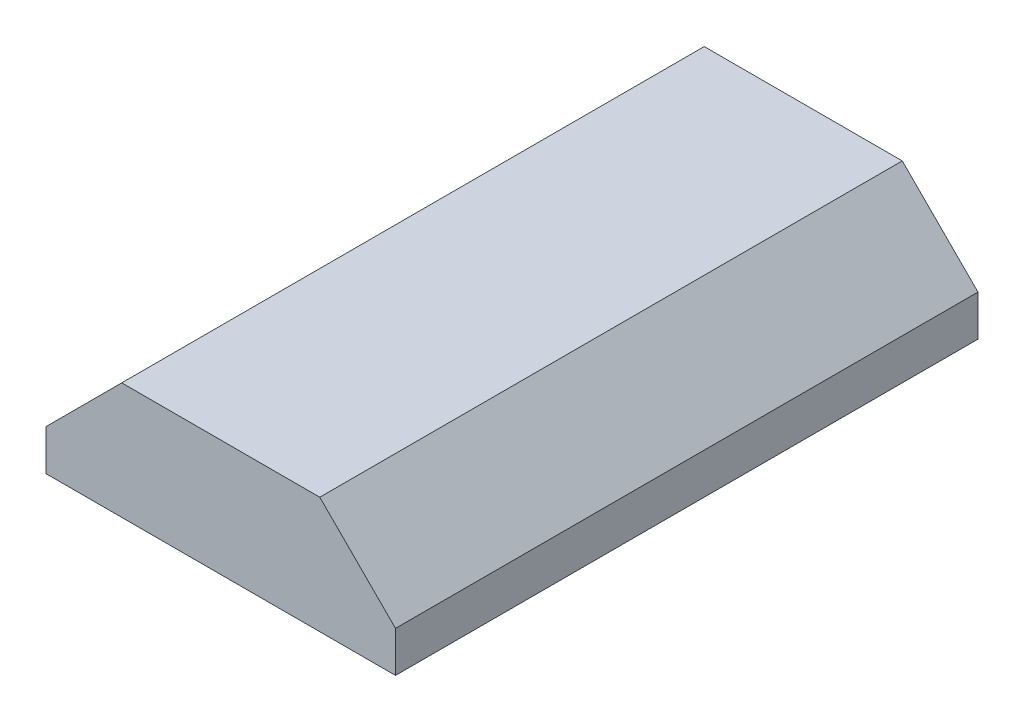
ISO-10303-21;
HEADER;
FILE_DESCRIPTION(('STEP AP214'),'2;1');
FILE_NAME('part.step','',(''),(''),'','','');
FILE_SCHEMA(('AUTOMOTIVE_DESIGN { 1 0 10303 214 1 1 1 1 }'));
ENDSEC;
DATA;
#1=APPLICATION_CONTEXT('core data for automotive mechanical design processes');
#2=APPLICATION_PROTOCOL_DEFINITION('international standard','automotive_design',2000,#1);
#3=PRODUCT_CONTEXT('',#1,'mechanical');
#4=PRODUCT('Part','Part','',(#3));
#5=PRODUCT_RELATED_PRODUCT_CATEGORY('part','',(#4));
#6=PRODUCT_DEFINITION_FORMATION('','',#4);
#7=PRODUCT_DEFINITION_CONTEXT('part definition',#1,'design');
#8=PRODUCT_DEFINITION('design','',#6,#7);
#9=PRODUCT_DEFINITION_SHAPE('','',#8);
#10=(LENGTH_UNIT() NAMED_UNIT(*) SI_UNIT(.MILLI.,.METRE.));
#11=(NAMED_UNIT(*) PLANE_ANGLE_UNIT() SI_UNIT($,.RADIAN.));
#12=(NAMED_UNIT(*) SI_UNIT($,.STERADIAN.) SOLID_ANGLE_UNIT());
#13=UNCERTAINTY_MEASURE_WITH_UNIT(LENGTH_MEASURE(1.E-05),#10,'distance_accuracy_value','');
#14=(GEOMETRIC_REPRESENTATION_CONTEXT(3) GLOBAL_UNCERTAINTY_ASSIGNED_CONTEXT((#13)) GLOBAL_UNIT_ASSIGNED_CONTEXT((#10,
#11,#12)) REPRESENTATION_CONTEXT('',''));
#15=CARTESIAN_POINT('',(0.,0.,0.));
#16=DIRECTION('',(0.,0.,1.));
#17=DIRECTION('',(1.,0.,0.));
#18=AXIS2_PLACEMENT_3D('',#15,#16,#17);
#19=CARTESIAN_POINT('',(3.4,1.80885878693797,20.));
#20=DIRECTION('',(0.707106781186549,0.707106781186546,0.));
#21=DIRECTION('',(-0.707106781186546,0.707106781186549,0.));
#22=AXIS2_PLACEMENT_3D('',#19,#20,#21);
#23=PLANE('',#22);
#24=DIRECTION('',(0.707106781186546,-0.707106781186549,0.));
#25=VECTOR('',#24,1.);
#26=CARTESIAN_POINT('',(3.4,1.80885878693797,0.));
#27=LINE('',#26,#25);
#28=CARTESIAN_POINT('',(3.4,1.80885878693797,0.));
#29=VERTEX_POINT('',#28);
#30=CARTESIAN_POINT('',(6.,-0.791141213062042,0.));
#31=VERTEX_POINT('',#30);
#32=EDGE_CURVE('E127',#29,#31,#27,.T.);
#33=ORIENTED_EDGE('',*,*,#32,.F.);
#34=DIRECTION('',(0.,0.,-1.));
#35=VECTOR('',#34,1.);
#36=CARTESIAN_POINT('',(3.4,1.80885878693797,20.));
#37=LINE('',#36,#35);
#38=CARTESIAN_POINT('',(3.4,1.80885878693797,20.));
#39=VERTEX_POINT('',#38);
#40=EDGE_CURVE('E11',#39,#29,#37,.T.);
#41=ORIENTED_EDGE('',*,*,#40,.F.);
#42=DIRECTION('',(0.707106781186546,-0.707106781186549,0.));
#43=VECTOR('',#42,1.);
#44=CARTESIAN_POINT('',(3.4,1.80885878693797,20.));
#45=LINE('',#44,#43);
#46=CARTESIAN_POINT('',(6.,-0.791141213062042,20.));
#47=VERTEX_POINT('',#46);
#48=EDGE_CURVE('E139',#39,#47,#45,.T.);
#49=ORIENTED_EDGE('',*,*,#48,.T.);
#50=DIRECTION('',(0.,0.,-1.));
#51=VECTOR('',#50,1.);
#52=CARTESIAN_POINT('',(6.,-0.791141213062042,20.));
#53=LINE('',#52,#51);
#54=EDGE_CURVE('E44',#47,#31,#53,.T.);
#55=ORIENTED_EDGE('',*,*,#54,.T.);
#56=EDGE_LOOP('',(#33,#41,#49,#55));
#57=FACE_BOUND('',#56,.T.);
#58=ADVANCED_FACE('F41',(#57),#23,.T.);
#59=CARTESIAN_POINT('',(3.4,1.80885878693797,20.));
#60=DIRECTION('',(0.,-1.,0.));
#61=DIRECTION('',(0.,0.,-1.));
#62=AXIS2_PLACEMENT_3D('',#59,#60,#61);
#63=PLANE('',#62);
#64=DIRECTION('',(-1.,0.,0.));
#65=VECTOR('',#64,1.);
#66=CARTESIAN_POINT('',(3.4,1.80885878693797,0.));
#67=LINE('',#66,#65);
#68=CARTESIAN_POINT('',(-3.4,1.80885878693797,0.));
#69=VERTEX_POINT('',#68);
#70=EDGE_CURVE('E80',#29,#69,#67,.T.);
#71=ORIENTED_EDGE('',*,*,#70,.T.);
#72=DIRECTION('',(0.,0.,-1.));
#73=VECTOR('',#72,1.);
#74=CARTESIAN_POINT('',(-3.4,1.80885878693797,20.));
#75=LINE('',#74,#73);
#76=CARTESIAN_POINT('',(-3.4,1.80885878693797,20.));
#77=VERTEX_POINT('',#76);
#78=EDGE_CURVE('E50',#77,#69,#75,.T.);
#79=ORIENTED_EDGE('',*,*,#78,.F.);
#80=DIRECTION('',(-1.,0.,0.));
#81=VECTOR('',#80,1.);
#82=CARTESIAN_POINT('',(3.4,1.80885878693797,20.));
#83=LINE('',#82,#81);
#84=EDGE_CURVE('E105',#39,#77,#83,.T.);
#85=ORIENTED_EDGE('',*,*,#84,.F.);
#86=ORIENTED_EDGE('',*,*,#40,.T.);
#87=EDGE_LOOP('',(#71,#79,#85,#86));
#88=FACE_BOUND('',#87,.T.);
#89=ADVANCED_FACE('F159',(#88),#63,.F.);
#90=CARTESIAN_POINT('',(-3.4,1.80885878693797,20.));
#91=DIRECTION('',(0.707106781186549,-0.707106781186546,0.));
#92=DIRECTION('',(0.707106781186546,0.707106781186549,0.));
#93=AXIS2_PLACEMENT_3D('',#90,#91,#92);
#94=PLANE('',#93);
#95=DIRECTION('',(-0.707106781186546,-0.707106781186549,0.));
#96=VECTOR('',#95,1.);
#97=CARTESIAN_POINT('',(-3.4,1.80885878693797,0.));
#98=LINE('',#97,#96);
#99=CARTESIAN_POINT('',(-6.,-0.791141213062042,0.));
#100=VERTEX_POINT('',#99);
#101=EDGE_CURVE('E112',#69,#100,#98,.T.);
#102=ORIENTED_EDGE('',*,*,#101,.T.);
#103=DIRECTION('',(0.,0.,-1.));
#104=VECTOR('',#103,1.);
#105=CARTESIAN_POINT('',(-6.,-0.791141213062042,20.));
#106=LINE('',#105,#104);
#107=CARTESIAN_POINT('',(-6.,-0.791141213062042,20.));
#108=VERTEX_POINT('',#107);
#109=EDGE_CURVE('E109',#108,#100,#106,.T.);
#110=ORIENTED_EDGE('',*,*,#109,.F.);
#111=DIRECTION('',(-0.707106781186546,-0.707106781186549,0.));
#112=VECTOR('',#111,1.);
#113=CARTESIAN_POINT('',(-3.4,1.80885878693797,20.));
#114=LINE('',#113,#112);
#115=EDGE_CURVE('E98',#77,#108,#114,.T.);
#116=ORIENTED_EDGE('',*,*,#115,.F.);
#117=ORIENTED_EDGE('',*,*,#78,.T.);
#118=EDGE_LOOP('',(#102,#110,#116,#117));
#119=FACE_BOUND('',#118,.T.);
#120=ADVANCED_FACE('F110',(#119),#94,.F.);
#121=CARTESIAN_POINT('',(-6.,-0.791141213062042,20.));
#122=DIRECTION('',(1.,0.,0.));
#123=DIRECTION('',(0.,0.,-1.));
#124=AXIS2_PLACEMENT_3D('',#121,#122,#123);
#125=PLANE('',#124);
#126=DIRECTION('',(0.,-1.,0.));
#127=VECTOR('',#126,1.);
#128=CARTESIAN_POINT('',(-6.,-0.791141213062042,0.));
#129=LINE('',#128,#127);
#130=CARTESIAN_POINT('',(-6.,-2.19114121306203,0.));
#131=VERTEX_POINT('',#130);
#132=EDGE_CURVE('E136',#100,#131,#129,.T.);
#133=ORIENTED_EDGE('',*,*,#132,.T.);
#134=DIRECTION('',(0.,0.,-1.));
#135=VECTOR('',#134,1.);
#136=CARTESIAN_POINT('',(-6.,-2.19114121306203,20.));
#137=LINE('',#136,#135);
#138=CARTESIAN_POINT('',(-6.,-2.19114121306203,20.));
#139=VERTEX_POINT('',#138);
#140=EDGE_CURVE('E115',#139,#131,#137,.T.);
#141=ORIENTED_EDGE('',*,*,#140,.F.);
#142=DIRECTION('',(0.,-1.,0.));
#143=VECTOR('',#142,1.);
#144=CARTESIAN_POINT('',(-6.,-0.791141213062042,20.));
#145=LINE('',#144,#143);
#146=EDGE_CURVE('E103',#108,#139,#145,.T.);
#147=ORIENTED_EDGE('',*,*,#146,.F.);
#148=ORIENTED_EDGE('',*,*,#109,.T.);
#149=EDGE_LOOP('',(#133,#141,#147,#148));
#150=FACE_BOUND('',#149,.T.);
#151=ADVANCED_FACE('F117',(#150),#125,.F.);
#152=CARTESIAN_POINT('',(-6.,-2.19114121306203,20.));
#153=DIRECTION('',(0.,1.,0.));
#154=DIRECTION('',(0.,0.,1.));
#155=AXIS2_PLACEMENT_3D('',#152,#153,#154);
#156=PLANE('',#155);
#157=DIRECTION('',(1.,0.,0.));
#158=VECTOR('',#157,1.);
#159=CARTESIAN_POINT('',(-6.,-2.19114121306203,0.));
#160=LINE('',#159,#158);
#161=CARTESIAN_POINT('',(6.,-2.19114121306203,0.));
#162=VERTEX_POINT('',#161);
#163=EDGE_CURVE('E133',#131,#162,#160,.T.);
#164=ORIENTED_EDGE('',*,*,#163,.T.);
#165=DIRECTION('',(0.,0.,-1.));
#166=VECTOR('',#165,1.);
#167=CARTESIAN_POINT('',(6.,-2.19114121306203,20.));
#168=LINE('',#167,#166);
#169=CARTESIAN_POINT('',(6.,-2.19114121306203,20.));
#170=VERTEX_POINT('',#169);
#171=EDGE_CURVE('E142',#170,#162,#168,.T.);
#172=ORIENTED_EDGE('',*,*,#171,.F.);
#173=DIRECTION('',(1.,0.,0.));
#174=VECTOR('',#173,1.);
#175=CARTESIAN_POINT('',(-6.,-2.19114121306203,20.));
#176=LINE('',#175,#174);
#177=EDGE_CURVE('E120',#139,#170,#176,.T.);
#178=ORIENTED_EDGE('',*,*,#177,.F.);
#179=ORIENTED_EDGE('',*,*,#140,.T.);
#180=EDGE_LOOP('',(#164,#172,#178,#179));
#181=FACE_BOUND('',#180,.T.);
#182=ADVANCED_FACE('F149',(#181),#156,.F.);
#183=CARTESIAN_POINT('',(6.,-0.791141213062042,20.));
#184=DIRECTION('',(1.,0.,0.));
#185=DIRECTION('',(0.,0.,-1.));
#186=AXIS2_PLACEMENT_3D('',#183,#184,#185);
#187=PLANE('',#186);
#188=DIRECTION('',(0.,-1.,0.));
#189=VECTOR('',#188,1.);
#190=CARTESIAN_POINT('',(6.,-0.791141213062042,0.));
#191=LINE('',#190,#189);
#192=EDGE_CURVE('E130',#31,#162,#191,.T.);
#193=ORIENTED_EDGE('',*,*,#192,.F.);
#194=ORIENTED_EDGE('',*,*,#54,.F.);
#195=DIRECTION('',(0.,-1.,0.));
#196=VECTOR('',#195,1.);
#197=CARTESIAN_POINT('',(6.,-0.791141213062042,20.));
#198=LINE('',#197,#196);
#199=EDGE_CURVE('E122',#47,#170,#198,.T.);
#200=ORIENTED_EDGE('',*,*,#199,.T.);
#201=ORIENTED_EDGE('',*,*,#171,.T.);
#202=EDGE_LOOP('',(#193,#194,#200,#201));
#203=FACE_BOUND('',#202,.T.);
#204=ADVANCED_FACE('F144',(#203),#187,.T.);
#205=CARTESIAN_POINT('',(0.,0.,20.));
#206=DIRECTION('',(0.,0.,-1.));
#207=DIRECTION('',(-1.,0.,0.));
#208=AXIS2_PLACEMENT_3D('',#205,#206,#207);
#209=PLANE('',#208);
#210=ORIENTED_EDGE('',*,*,#48,.F.);
#211=ORIENTED_EDGE('',*,*,#84,.T.);
#212=ORIENTED_EDGE('',*,*,#115,.T.);
#213=ORIENTED_EDGE('',*,*,#146,.T.);
#214=ORIENTED_EDGE('',*,*,#177,.T.);
#215=ORIENTED_EDGE('',*,*,#199,.F.);
#216=EDGE_LOOP('',(#210,#211,#212,#213,#214,#215));
#217=FACE_BOUND('',#216,.T.);
#218=ADVANCED_FACE('F101',(#217),#209,.F.);
#219=CARTESIAN_POINT('',(0.,0.,0.));
#220=DIRECTION('',(0.,0.,-1.));
#221=DIRECTION('',(-1.,0.,0.));
#222=AXIS2_PLACEMENT_3D('',#219,#220,#221);
#223=PLANE('',#222);
#224=ORIENTED_EDGE('',*,*,#32,.T.);
#225=ORIENTED_EDGE('',*,*,#192,.T.);
#226=ORIENTED_EDGE('',*,*,#163,.F.);
#227=ORIENTED_EDGE('',*,*,#132,.F.);
#228=ORIENTED_EDGE('',*,*,#101,.F.);
#229=ORIENTED_EDGE('',*,*,#70,.F.);
#230=EDGE_LOOP('',(#224,#225,#226,#227,#228,#229));
#231=FACE_BOUND('',#230,.T.);
#232=ADVANCED_FACE('F147',(#231),#223,.T.);
#233=CLOSED_SHELL('',(#58,#89,#120,#151,#182,#204,#218,#232));
#234=MANIFOLD_SOLID_BREP('B2',#233);
#235=ADVANCED_BREP_SHAPE_REPRESENTATION('',(#18,#234),#14);
#236=SHAPE_DEFINITION_REPRESENTATION(#9,#235);
ENDSEC;
END-ISO-10303-21;
